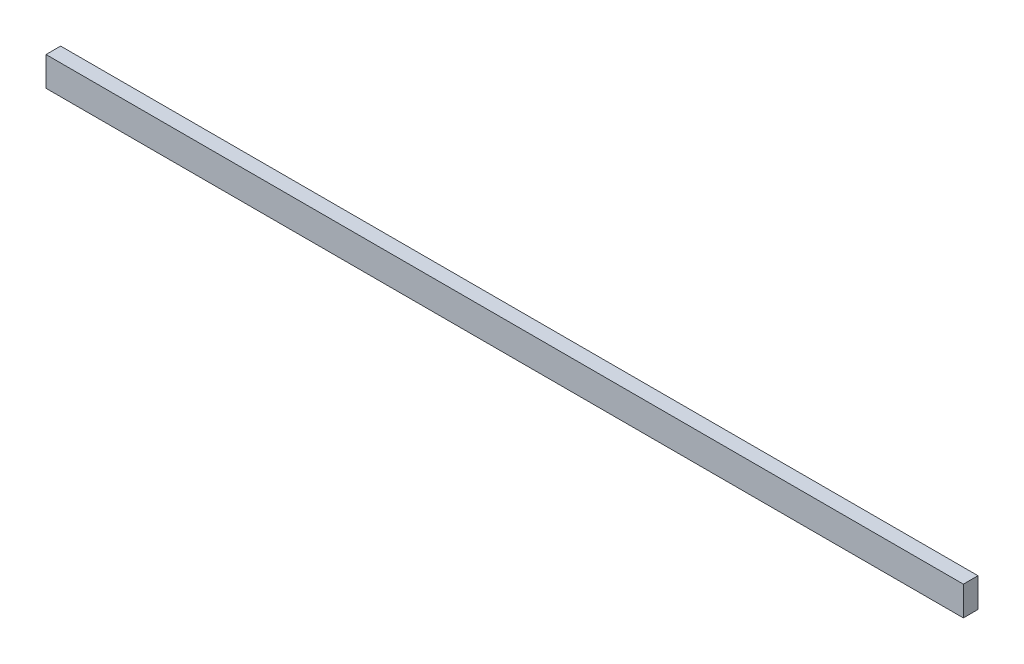
ISO-10303-21;
HEADER;
FILE_DESCRIPTION(('STEP AP214'),'2;1');
FILE_NAME('part.step','',(''),(''),'','','');
FILE_SCHEMA(('AUTOMOTIVE_DESIGN { 1 0 10303 214 1 1 1 1 }'));
ENDSEC;
DATA;
#1=APPLICATION_CONTEXT('core data for automotive mechanical design processes');
#2=APPLICATION_PROTOCOL_DEFINITION('international standard','automotive_design',2000,#1);
#3=PRODUCT_CONTEXT('',#1,'mechanical');
#4=PRODUCT('Part','Part','',(#3));
#5=PRODUCT_RELATED_PRODUCT_CATEGORY('part','',(#4));
#6=PRODUCT_DEFINITION_FORMATION('','',#4);
#7=PRODUCT_DEFINITION_CONTEXT('part definition',#1,'design');
#8=PRODUCT_DEFINITION('design','',#6,#7);
#9=PRODUCT_DEFINITION_SHAPE('','',#8);
#10=(LENGTH_UNIT() NAMED_UNIT(*) SI_UNIT(.MILLI.,.METRE.));
#11=(NAMED_UNIT(*) PLANE_ANGLE_UNIT() SI_UNIT($,.RADIAN.));
#12=(NAMED_UNIT(*) SI_UNIT($,.STERADIAN.) SOLID_ANGLE_UNIT());
#13=UNCERTAINTY_MEASURE_WITH_UNIT(LENGTH_MEASURE(1.E-05),#10,'distance_accuracy_value','');
#14=(GEOMETRIC_REPRESENTATION_CONTEXT(3) GLOBAL_UNCERTAINTY_ASSIGNED_CONTEXT((#13)) GLOBAL_UNIT_ASSIGNED_CONTEXT((#10,
#11,#12)) REPRESENTATION_CONTEXT('',''));
#15=CARTESIAN_POINT('',(0.,0.,0.));
#16=DIRECTION('',(0.,0.,1.));
#17=DIRECTION('',(1.,0.,0.));
#18=AXIS2_PLACEMENT_3D('',#15,#16,#17);
#19=CARTESIAN_POINT('',(0.,0.,15.));
#20=DIRECTION('',(1.,0.,0.));
#21=DIRECTION('',(0.,0.,-1.));
#22=AXIS2_PLACEMENT_3D('',#19,#20,#21);
#23=PLANE('',#22);
#24=DIRECTION('',(0.,-1.,0.));
#25=VECTOR('',#24,1.);
#26=CARTESIAN_POINT('',(0.,0.,0.));
#27=LINE('',#26,#25);
#28=CARTESIAN_POINT('',(0.,30.,0.));
#29=VERTEX_POINT('',#28);
#30=CARTESIAN_POINT('',(0.,0.,0.));
#31=VERTEX_POINT('',#30);
#32=EDGE_CURVE('E109',#29,#31,#27,.T.);
#33=ORIENTED_EDGE('',*,*,#32,.T.);
#34=DIRECTION('',(0.,0.,-1.));
#35=VECTOR('',#34,1.);
#36=CARTESIAN_POINT('',(0.,0.,15.));
#37=LINE('',#36,#35);
#38=CARTESIAN_POINT('',(0.,0.,15.));
#39=VERTEX_POINT('',#38);
#40=EDGE_CURVE('E11',#39,#31,#37,.T.);
#41=ORIENTED_EDGE('',*,*,#40,.F.);
#42=DIRECTION('',(0.,-1.,0.));
#43=VECTOR('',#42,1.);
#44=CARTESIAN_POINT('',(0.,0.,15.));
#45=LINE('',#44,#43);
#46=CARTESIAN_POINT('',(0.,30.,15.));
#47=VERTEX_POINT('',#46);
#48=EDGE_CURVE('E98',#47,#39,#45,.T.);
#49=ORIENTED_EDGE('',*,*,#48,.F.);
#50=DIRECTION('',(0.,0.,-1.));
#51=VECTOR('',#50,1.);
#52=CARTESIAN_POINT('',(0.,30.,15.));
#53=LINE('',#52,#51);
#54=EDGE_CURVE('E106',#47,#29,#53,.T.);
#55=ORIENTED_EDGE('',*,*,#54,.T.);
#56=EDGE_LOOP('',(#33,#41,#49,#55));
#57=FACE_BOUND('',#56,.T.);
#58=ADVANCED_FACE('F50',(#57),#23,.F.);
#59=CARTESIAN_POINT('',(0.,0.,15.));
#60=DIRECTION('',(0.,1.,0.));
#61=DIRECTION('',(0.,0.,1.));
#62=AXIS2_PLACEMENT_3D('',#59,#60,#61);
#63=PLANE('',#62);
#64=DIRECTION('',(1.,0.,0.));
#65=VECTOR('',#64,1.);
#66=CARTESIAN_POINT('',(0.,0.,0.));
#67=LINE('',#66,#65);
#68=CARTESIAN_POINT('',(940.,0.,0.));
#69=VERTEX_POINT('',#68);
#70=EDGE_CURVE('E105',#31,#69,#67,.T.);
#71=ORIENTED_EDGE('',*,*,#70,.T.);
#72=DIRECTION('',(0.,0.,-1.));
#73=VECTOR('',#72,1.);
#74=CARTESIAN_POINT('',(940.,0.,15.));
#75=LINE('',#74,#73);
#76=CARTESIAN_POINT('',(940.,0.,15.));
#77=VERTEX_POINT('',#76);
#78=EDGE_CURVE('E54',#77,#69,#75,.T.);
#79=ORIENTED_EDGE('',*,*,#78,.F.);
#80=DIRECTION('',(1.,0.,0.));
#81=VECTOR('',#80,1.);
#82=CARTESIAN_POINT('',(0.,0.,15.));
#83=LINE('',#82,#81);
#84=EDGE_CURVE('E91',#39,#77,#83,.T.);
#85=ORIENTED_EDGE('',*,*,#84,.F.);
#86=ORIENTED_EDGE('',*,*,#40,.T.);
#87=EDGE_LOOP('',(#71,#79,#85,#86));
#88=FACE_BOUND('',#87,.T.);
#89=ADVANCED_FACE('F101',(#88),#63,.F.);
#90=CARTESIAN_POINT('',(940.,0.,15.));
#91=DIRECTION('',(-1.,0.,0.));
#92=DIRECTION('',(0.,0.,1.));
#93=AXIS2_PLACEMENT_3D('',#90,#91,#92);
#94=PLANE('',#93);
#95=DIRECTION('',(0.,1.,0.));
#96=VECTOR('',#95,1.);
#97=CARTESIAN_POINT('',(940.,0.,0.));
#98=LINE('',#97,#96);
#99=CARTESIAN_POINT('',(940.,30.,0.));
#100=VERTEX_POINT('',#99);
#101=EDGE_CURVE('E77',#69,#100,#98,.T.);
#102=ORIENTED_EDGE('',*,*,#101,.T.);
#103=DIRECTION('',(0.,0.,-1.));
#104=VECTOR('',#103,1.);
#105=CARTESIAN_POINT('',(940.,30.,15.));
#106=LINE('',#105,#104);
#107=CARTESIAN_POINT('',(940.,30.,15.));
#108=VERTEX_POINT('',#107);
#109=EDGE_CURVE('E103',#108,#100,#106,.T.);
#110=ORIENTED_EDGE('',*,*,#109,.F.);
#111=DIRECTION('',(0.,1.,0.));
#112=VECTOR('',#111,1.);
#113=CARTESIAN_POINT('',(940.,0.,15.));
#114=LINE('',#113,#112);
#115=EDGE_CURVE('E96',#77,#108,#114,.T.);
#116=ORIENTED_EDGE('',*,*,#115,.F.);
#117=ORIENTED_EDGE('',*,*,#78,.T.);
#118=EDGE_LOOP('',(#102,#110,#116,#117));
#119=FACE_BOUND('',#118,.T.);
#120=ADVANCED_FACE('F102',(#119),#94,.F.);
#121=CARTESIAN_POINT('',(0.,30.,15.));
#122=DIRECTION('',(0.,-1.,0.));
#123=DIRECTION('',(0.,0.,-1.));
#124=AXIS2_PLACEMENT_3D('',#121,#122,#123);
#125=PLANE('',#124);
#126=DIRECTION('',(-1.,0.,0.));
#127=VECTOR('',#126,1.);
#128=CARTESIAN_POINT('',(0.,30.,0.));
#129=LINE('',#128,#127);
#130=EDGE_CURVE('E88',#100,#29,#129,.T.);
#131=ORIENTED_EDGE('',*,*,#130,.T.);
#132=ORIENTED_EDGE('',*,*,#54,.F.);
#133=DIRECTION('',(-1.,0.,0.));
#134=VECTOR('',#133,1.);
#135=CARTESIAN_POINT('',(0.,30.,15.));
#136=LINE('',#135,#134);
#137=EDGE_CURVE('E65',#108,#47,#136,.T.);
#138=ORIENTED_EDGE('',*,*,#137,.F.);
#139=ORIENTED_EDGE('',*,*,#109,.T.);
#140=EDGE_LOOP('',(#131,#132,#138,#139));
#141=FACE_BOUND('',#140,.T.);
#142=ADVANCED_FACE('F116',(#141),#125,.F.);
#143=CARTESIAN_POINT('',(0.,0.,15.));
#144=DIRECTION('',(0.,0.,-1.));
#145=DIRECTION('',(-1.,0.,0.));
#146=AXIS2_PLACEMENT_3D('',#143,#144,#145);
#147=PLANE('',#146);
#148=ORIENTED_EDGE('',*,*,#48,.T.);
#149=ORIENTED_EDGE('',*,*,#84,.T.);
#150=ORIENTED_EDGE('',*,*,#115,.T.);
#151=ORIENTED_EDGE('',*,*,#137,.T.);
#152=EDGE_LOOP('',(#148,#149,#150,#151));
#153=FACE_BOUND('',#152,.T.);
#154=ADVANCED_FACE('F94',(#153),#147,.F.);
#155=CARTESIAN_POINT('',(0.,0.,0.));
#156=DIRECTION('',(0.,0.,-1.));
#157=DIRECTION('',(-1.,0.,0.));
#158=AXIS2_PLACEMENT_3D('',#155,#156,#157);
#159=PLANE('',#158);
#160=ORIENTED_EDGE('',*,*,#32,.F.);
#161=ORIENTED_EDGE('',*,*,#130,.F.);
#162=ORIENTED_EDGE('',*,*,#101,.F.);
#163=ORIENTED_EDGE('',*,*,#70,.F.);
#164=EDGE_LOOP('',(#160,#161,#162,#163));
#165=FACE_BOUND('',#164,.T.);
#166=ADVANCED_FACE('F117',(#165),#159,.T.);
#167=CLOSED_SHELL('',(#58,#89,#120,#142,#154,#166));
#168=MANIFOLD_SOLID_BREP('B2',#167);
#169=ADVANCED_BREP_SHAPE_REPRESENTATION('',(#18,#168),#14);
#170=SHAPE_DEFINITION_REPRESENTATION(#9,#169);
ENDSEC;
END-ISO-10303-21;
